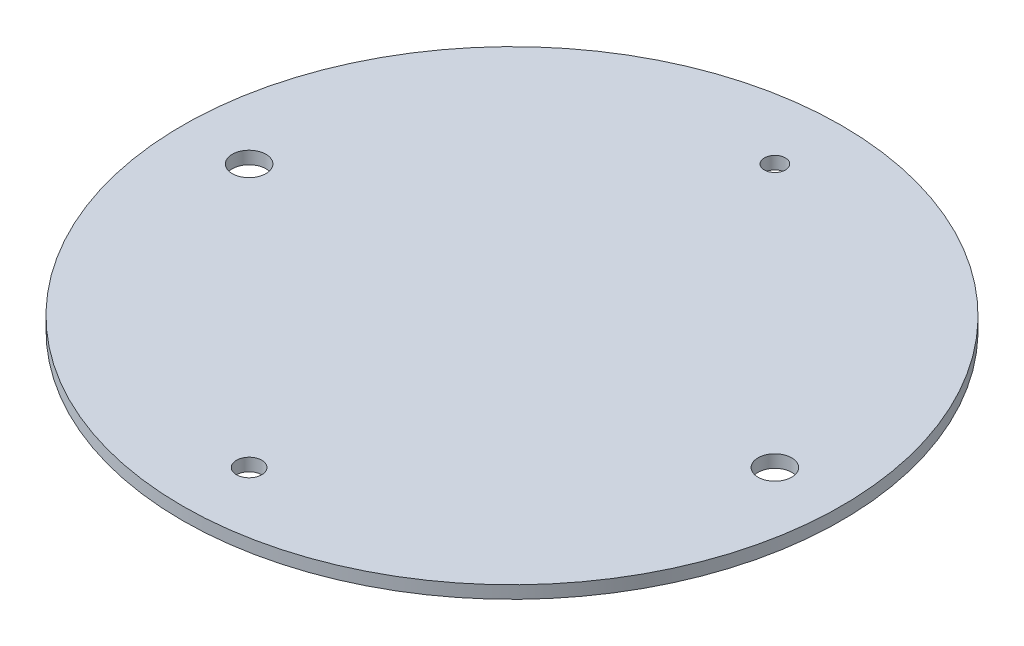
ISO-10303-21;
HEADER;
FILE_DESCRIPTION(('STEP AP214'),'2;1');
FILE_NAME('part.step','',(''),(''),'','','');
FILE_SCHEMA(('AUTOMOTIVE_DESIGN { 1 0 10303 214 1 1 1 1 }'));
ENDSEC;
DATA;
#1=APPLICATION_CONTEXT('core data for automotive mechanical design processes');
#2=APPLICATION_PROTOCOL_DEFINITION('international standard','automotive_design',2000,#1);
#3=PRODUCT_CONTEXT('',#1,'mechanical');
#4=PRODUCT('Part','Part','',(#3));
#5=PRODUCT_RELATED_PRODUCT_CATEGORY('part','',(#4));
#6=PRODUCT_DEFINITION_FORMATION('','',#4);
#7=PRODUCT_DEFINITION_CONTEXT('part definition',#1,'design');
#8=PRODUCT_DEFINITION('design','',#6,#7);
#9=PRODUCT_DEFINITION_SHAPE('','',#8);
#10=(LENGTH_UNIT() NAMED_UNIT(*) SI_UNIT(.MILLI.,.METRE.));
#11=(NAMED_UNIT(*) PLANE_ANGLE_UNIT() SI_UNIT($,.RADIAN.));
#12=(NAMED_UNIT(*) SI_UNIT($,.STERADIAN.) SOLID_ANGLE_UNIT());
#13=UNCERTAINTY_MEASURE_WITH_UNIT(LENGTH_MEASURE(1.E-05),#10,'distance_accuracy_value','');
#14=(GEOMETRIC_REPRESENTATION_CONTEXT(3) GLOBAL_UNCERTAINTY_ASSIGNED_CONTEXT((#13)) GLOBAL_UNIT_ASSIGNED_CONTEXT((#10,
#11,#12)) REPRESENTATION_CONTEXT('',''));
#15=CARTESIAN_POINT('',(0.,0.,0.));
#16=DIRECTION('',(0.,0.,1.));
#17=DIRECTION('',(1.,0.,0.));
#18=AXIS2_PLACEMENT_3D('',#15,#16,#17);
#19=CARTESIAN_POINT('',(0.,3.,0.));
#20=DIRECTION('',(0.,1.,0.));
#21=DIRECTION('',(0.,0.,1.));
#22=AXIS2_PLACEMENT_3D('',#19,#20,#21);
#23=PLANE('',#22);
#24=CARTESIAN_POINT('',(0.,3.,-62.5));
#25=DIRECTION('',(0.,1.,0.));
#26=DIRECTION('',(0.,0.,1.));
#27=AXIS2_PLACEMENT_3D('',#24,#25,#26);
#28=CIRCLE('',#27,2.5);
#29=CARTESIAN_POINT('',(0.,3.,-60.));
#30=VERTEX_POINT('',#29);
#31=EDGE_CURVE('E64',#30,#30,#28,.T.);
#32=ORIENTED_EDGE('',*,*,#31,.F.);
#33=EDGE_LOOP('',(#32));
#34=FACE_BOUND('',#33,.T.);
#35=CARTESIAN_POINT('',(-62.5,3.,0.));
#36=DIRECTION('',(0.,1.,0.));
#37=DIRECTION('',(0.,0.,1.));
#38=AXIS2_PLACEMENT_3D('',#35,#36,#37);
#39=CIRCLE('',#38,4.00000000000001);
#40=CARTESIAN_POINT('',(-62.5,3.,4.00000000000001));
#41=VERTEX_POINT('',#40);
#42=EDGE_CURVE('E50',#41,#41,#39,.T.);
#43=ORIENTED_EDGE('',*,*,#42,.F.);
#44=EDGE_LOOP('',(#43));
#45=FACE_BOUND('',#44,.T.);
#46=CARTESIAN_POINT('',(0.,3.,0.));
#47=DIRECTION('',(0.,1.,0.));
#48=DIRECTION('',(0.,0.,1.));
#49=AXIS2_PLACEMENT_3D('',#46,#47,#48);
#50=CIRCLE('',#49,78.35);
#51=CARTESIAN_POINT('',(0.,3.,78.35));
#52=VERTEX_POINT('',#51);
#53=EDGE_CURVE('E10',#52,#52,#50,.T.);
#54=ORIENTED_EDGE('',*,*,#53,.T.);
#55=EDGE_LOOP('',(#54));
#56=FACE_BOUND('',#55,.T.);
#57=CARTESIAN_POINT('',(0.,3.,62.5));
#58=DIRECTION('',(0.,1.,0.));
#59=DIRECTION('',(0.,0.,1.));
#60=AXIS2_PLACEMENT_3D('',#57,#58,#59);
#61=CIRCLE('',#60,3.);
#62=CARTESIAN_POINT('',(0.,3.,65.5));
#63=VERTEX_POINT('',#62);
#64=EDGE_CURVE('E56',#63,#63,#61,.T.);
#65=ORIENTED_EDGE('',*,*,#64,.F.);
#66=EDGE_LOOP('',(#65));
#67=FACE_BOUND('',#66,.T.);
#68=CARTESIAN_POINT('',(62.5,3.,0.));
#69=DIRECTION('',(0.,1.,0.));
#70=DIRECTION('',(0.,0.,1.));
#71=AXIS2_PLACEMENT_3D('',#68,#69,#70);
#72=CIRCLE('',#71,4.00000000000001);
#73=CARTESIAN_POINT('',(62.5,3.,4.00000000000001));
#74=VERTEX_POINT('',#73);
#75=EDGE_CURVE('E72',#74,#74,#72,.T.);
#76=ORIENTED_EDGE('',*,*,#75,.F.);
#77=EDGE_LOOP('',(#76));
#78=FACE_BOUND('',#77,.T.);
#79=ADVANCED_FACE('F37',(#34,#45,#56,#67,#78),#23,.T.);
#80=CARTESIAN_POINT('',(0.,0.,0.));
#81=DIRECTION('',(0.,1.,0.));
#82=DIRECTION('',(0.,0.,1.));
#83=AXIS2_PLACEMENT_3D('',#80,#81,#82);
#84=PLANE('',#83);
#85=CARTESIAN_POINT('',(0.,0.,0.));
#86=DIRECTION('',(0.,1.,0.));
#87=DIRECTION('',(0.,0.,1.));
#88=AXIS2_PLACEMENT_3D('',#85,#86,#87);
#89=CIRCLE('',#88,78.35);
#90=CARTESIAN_POINT('',(0.,0.,78.35));
#91=VERTEX_POINT('',#90);
#92=EDGE_CURVE('E41',#91,#91,#89,.T.);
#93=ORIENTED_EDGE('',*,*,#92,.F.);
#94=EDGE_LOOP('',(#93));
#95=FACE_BOUND('',#94,.T.);
#96=CARTESIAN_POINT('',(-62.5,0.,0.));
#97=DIRECTION('',(0.,1.,0.));
#98=DIRECTION('',(0.,0.,1.));
#99=AXIS2_PLACEMENT_3D('',#96,#97,#98);
#100=CIRCLE('',#99,4.00000000000001);
#101=CARTESIAN_POINT('',(-62.5,0.,4.00000000000001));
#102=VERTEX_POINT('',#101);
#103=EDGE_CURVE('E52',#102,#102,#100,.T.);
#104=ORIENTED_EDGE('',*,*,#103,.T.);
#105=EDGE_LOOP('',(#104));
#106=FACE_BOUND('',#105,.T.);
#107=CARTESIAN_POINT('',(0.,0.,62.5));
#108=DIRECTION('',(0.,1.,0.));
#109=DIRECTION('',(0.,0.,1.));
#110=AXIS2_PLACEMENT_3D('',#107,#108,#109);
#111=CIRCLE('',#110,3.);
#112=CARTESIAN_POINT('',(0.,0.,65.5));
#113=VERTEX_POINT('',#112);
#114=EDGE_CURVE('E60',#113,#113,#111,.T.);
#115=ORIENTED_EDGE('',*,*,#114,.T.);
#116=EDGE_LOOP('',(#115));
#117=FACE_BOUND('',#116,.T.);
#118=CARTESIAN_POINT('',(0.,0.,-62.5));
#119=DIRECTION('',(0.,1.,0.));
#120=DIRECTION('',(0.,0.,1.));
#121=AXIS2_PLACEMENT_3D('',#118,#119,#120);
#122=CIRCLE('',#121,2.5);
#123=CARTESIAN_POINT('',(0.,0.,-60.));
#124=VERTEX_POINT('',#123);
#125=EDGE_CURVE('E68',#124,#124,#122,.T.);
#126=ORIENTED_EDGE('',*,*,#125,.T.);
#127=EDGE_LOOP('',(#126));
#128=FACE_BOUND('',#127,.T.);
#129=CARTESIAN_POINT('',(62.5,0.,0.));
#130=DIRECTION('',(0.,1.,0.));
#131=DIRECTION('',(0.,0.,1.));
#132=AXIS2_PLACEMENT_3D('',#129,#130,#131);
#133=CIRCLE('',#132,4.00000000000001);
#134=CARTESIAN_POINT('',(62.5,0.,4.00000000000001));
#135=VERTEX_POINT('',#134);
#136=EDGE_CURVE('E76',#135,#135,#133,.T.);
#137=ORIENTED_EDGE('',*,*,#136,.T.);
#138=EDGE_LOOP('',(#137));
#139=FACE_BOUND('',#138,.T.);
#140=ADVANCED_FACE('F88',(#95,#106,#117,#128,#139),#84,.F.);
#141=CARTESIAN_POINT('',(0.,3.,0.));
#142=DIRECTION('',(0.,-1.,0.));
#143=DIRECTION('',(0.,0.,-1.));
#144=AXIS2_PLACEMENT_3D('',#141,#142,#143);
#145=CYLINDRICAL_SURFACE('',#144,78.35);
#146=ORIENTED_EDGE('',*,*,#53,.F.);
#147=EDGE_LOOP('',(#146));
#148=FACE_BOUND('',#147,.T.);
#149=ORIENTED_EDGE('',*,*,#92,.T.);
#150=EDGE_LOOP('',(#149));
#151=FACE_BOUND('',#150,.T.);
#152=ADVANCED_FACE('F39',(#148,#151),#145,.T.);
#153=CARTESIAN_POINT('',(-62.5,3.,0.));
#154=DIRECTION('',(0.,-1.,0.));
#155=DIRECTION('',(0.,0.,-1.));
#156=AXIS2_PLACEMENT_3D('',#153,#154,#155);
#157=CYLINDRICAL_SURFACE('',#156,4.00000000000001);
#158=ORIENTED_EDGE('',*,*,#42,.T.);
#159=EDGE_LOOP('',(#158));
#160=FACE_BOUND('',#159,.T.);
#161=ORIENTED_EDGE('',*,*,#103,.F.);
#162=EDGE_LOOP('',(#161));
#163=FACE_BOUND('',#162,.T.);
#164=ADVANCED_FACE('F98',(#160,#163),#157,.F.);
#165=CARTESIAN_POINT('',(0.,3.,62.5));
#166=DIRECTION('',(0.,-1.,0.));
#167=DIRECTION('',(0.,0.,-1.));
#168=AXIS2_PLACEMENT_3D('',#165,#166,#167);
#169=CYLINDRICAL_SURFACE('',#168,3.);
#170=ORIENTED_EDGE('',*,*,#64,.T.);
#171=EDGE_LOOP('',(#170));
#172=FACE_BOUND('',#171,.T.);
#173=ORIENTED_EDGE('',*,*,#114,.F.);
#174=EDGE_LOOP('',(#173));
#175=FACE_BOUND('',#174,.T.);
#176=ADVANCED_FACE('F101',(#172,#175),#169,.F.);
#177=CARTESIAN_POINT('',(0.,3.,-62.5));
#178=DIRECTION('',(0.,-1.,0.));
#179=DIRECTION('',(0.,0.,-1.));
#180=AXIS2_PLACEMENT_3D('',#177,#178,#179);
#181=CYLINDRICAL_SURFACE('',#180,2.5);
#182=ORIENTED_EDGE('',*,*,#31,.T.);
#183=EDGE_LOOP('',(#182));
#184=FACE_BOUND('',#183,.T.);
#185=ORIENTED_EDGE('',*,*,#125,.F.);
#186=EDGE_LOOP('',(#185));
#187=FACE_BOUND('',#186,.T.);
#188=ADVANCED_FACE('F105',(#184,#187),#181,.F.);
#189=CARTESIAN_POINT('',(62.5,3.,0.));
#190=DIRECTION('',(0.,-1.,0.));
#191=DIRECTION('',(0.,0.,-1.));
#192=AXIS2_PLACEMENT_3D('',#189,#190,#191);
#193=CYLINDRICAL_SURFACE('',#192,4.00000000000001);
#194=ORIENTED_EDGE('',*,*,#75,.T.);
#195=EDGE_LOOP('',(#194));
#196=FACE_BOUND('',#195,.T.);
#197=ORIENTED_EDGE('',*,*,#136,.F.);
#198=EDGE_LOOP('',(#197));
#199=FACE_BOUND('',#198,.T.);
#200=ADVANCED_FACE('F84',(#196,#199),#193,.F.);
#201=CLOSED_SHELL('',(#79,#140,#152,#164,#176,#188,#200));
#202=MANIFOLD_SOLID_BREP('B2',#201);
#203=ADVANCED_BREP_SHAPE_REPRESENTATION('',(#18,#202),#14);
#204=SHAPE_DEFINITION_REPRESENTATION(#9,#203);
ENDSEC;
END-ISO-10303-21;
